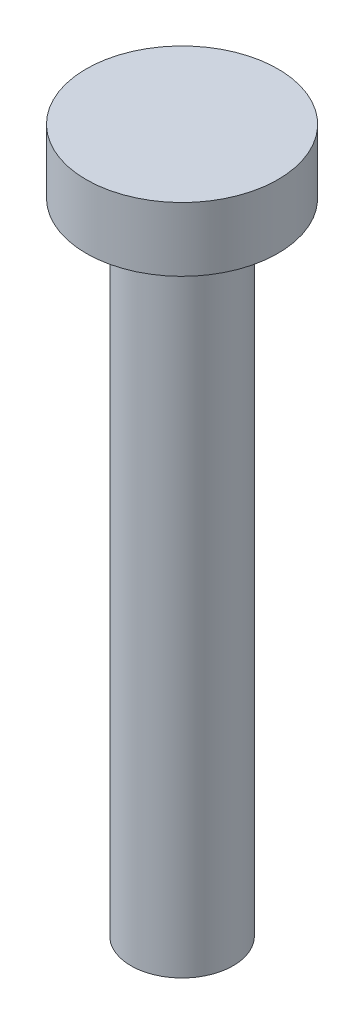
ISO-10303-21;
HEADER;
FILE_DESCRIPTION(('STEP AP214'),'2;1');
FILE_NAME('part.step','',(''),(''),'','','');
FILE_SCHEMA(('AUTOMOTIVE_DESIGN { 1 0 10303 214 1 1 1 1 }'));
ENDSEC;
DATA;
#1=APPLICATION_CONTEXT('core data for automotive mechanical design processes');
#2=APPLICATION_PROTOCOL_DEFINITION('international standard','automotive_design',2000,#1);
#3=PRODUCT_CONTEXT('',#1,'mechanical');
#4=PRODUCT('Part','Part','',(#3));
#5=PRODUCT_RELATED_PRODUCT_CATEGORY('part','',(#4));
#6=PRODUCT_DEFINITION_FORMATION('','',#4);
#7=PRODUCT_DEFINITION_CONTEXT('part definition',#1,'design');
#8=PRODUCT_DEFINITION('design','',#6,#7);
#9=PRODUCT_DEFINITION_SHAPE('','',#8);
#10=(LENGTH_UNIT() NAMED_UNIT(*) SI_UNIT(.MILLI.,.METRE.));
#11=(NAMED_UNIT(*) PLANE_ANGLE_UNIT() SI_UNIT($,.RADIAN.));
#12=(NAMED_UNIT(*) SI_UNIT($,.STERADIAN.) SOLID_ANGLE_UNIT());
#13=UNCERTAINTY_MEASURE_WITH_UNIT(LENGTH_MEASURE(1.E-05),#10,'distance_accuracy_value','');
#14=(GEOMETRIC_REPRESENTATION_CONTEXT(3) GLOBAL_UNCERTAINTY_ASSIGNED_CONTEXT((#13)) GLOBAL_UNIT_ASSIGNED_CONTEXT((#10,
#11,#12)) REPRESENTATION_CONTEXT('',''));
#15=CARTESIAN_POINT('',(0.,0.,0.));
#16=DIRECTION('',(0.,0.,1.));
#17=DIRECTION('',(1.,0.,0.));
#18=AXIS2_PLACEMENT_3D('',#15,#16,#17);
#19=CARTESIAN_POINT('',(0.,100.,0.));
#20=DIRECTION('',(0.,-1.,0.));
#21=DIRECTION('',(0.,0.,-1.));
#22=AXIS2_PLACEMENT_3D('',#19,#20,#21);
#23=CYLINDRICAL_SURFACE('',#22,8.);
#24=CARTESIAN_POINT('',(0.,100.,0.));
#25=DIRECTION('',(0.,1.,0.));
#26=DIRECTION('',(0.,0.,1.));
#27=AXIS2_PLACEMENT_3D('',#24,#25,#26);
#28=CIRCLE('',#27,8.);
#29=CARTESIAN_POINT('',(0.,100.,8.));
#30=VERTEX_POINT('',#29);
#31=EDGE_CURVE('E10',#30,#30,#28,.T.);
#32=ORIENTED_EDGE('',*,*,#31,.F.);
#33=EDGE_LOOP('',(#32));
#34=FACE_BOUND('',#33,.T.);
#35=CARTESIAN_POINT('',(0.,0.,0.));
#36=DIRECTION('',(0.,1.,0.));
#37=DIRECTION('',(0.,0.,1.));
#38=AXIS2_PLACEMENT_3D('',#35,#36,#37);
#39=CIRCLE('',#38,8.);
#40=CARTESIAN_POINT('',(0.,0.,8.));
#41=VERTEX_POINT('',#40);
#42=EDGE_CURVE('E37',#41,#41,#39,.T.);
#43=ORIENTED_EDGE('',*,*,#42,.T.);
#44=EDGE_LOOP('',(#43));
#45=FACE_BOUND('',#44,.T.);
#46=ADVANCED_FACE('F34',(#34,#45),#23,.T.);
#47=CARTESIAN_POINT('',(0.,0.,0.));
#48=DIRECTION('',(0.,1.,0.));
#49=DIRECTION('',(0.,0.,1.));
#50=AXIS2_PLACEMENT_3D('',#47,#48,#49);
#51=PLANE('',#50);
#52=ORIENTED_EDGE('',*,*,#42,.F.);
#53=EDGE_LOOP('',(#52));
#54=FACE_BOUND('',#53,.T.);
#55=ADVANCED_FACE('F57',(#54),#51,.F.);
#56=CARTESIAN_POINT('',(0.,110.,0.));
#57=DIRECTION('',(0.,-1.,0.));
#58=DIRECTION('',(0.,0.,-1.));
#59=AXIS2_PLACEMENT_3D('',#56,#57,#58);
#60=CYLINDRICAL_SURFACE('',#59,15.);
#61=CARTESIAN_POINT('',(0.,110.,0.));
#62=DIRECTION('',(0.,1.,0.));
#63=DIRECTION('',(0.,0.,1.));
#64=AXIS2_PLACEMENT_3D('',#61,#62,#63);
#65=CIRCLE('',#64,15.);
#66=CARTESIAN_POINT('',(0.,110.,15.));
#67=VERTEX_POINT('',#66);
#68=EDGE_CURVE('E44',#67,#67,#65,.T.);
#69=ORIENTED_EDGE('',*,*,#68,.F.);
#70=EDGE_LOOP('',(#69));
#71=FACE_BOUND('',#70,.T.);
#72=CARTESIAN_POINT('',(0.,100.,0.));
#73=DIRECTION('',(0.,1.,0.));
#74=DIRECTION('',(0.,0.,1.));
#75=AXIS2_PLACEMENT_3D('',#72,#73,#74);
#76=CIRCLE('',#75,15.);
#77=CARTESIAN_POINT('',(0.,100.,15.));
#78=VERTEX_POINT('',#77);
#79=EDGE_CURVE('E46',#78,#78,#76,.T.);
#80=ORIENTED_EDGE('',*,*,#79,.T.);
#81=EDGE_LOOP('',(#80));
#82=FACE_BOUND('',#81,.T.);
#83=ADVANCED_FACE('F54',(#71,#82),#60,.T.);
#84=CARTESIAN_POINT('',(0.,110.,0.));
#85=DIRECTION('',(0.,1.,0.));
#86=DIRECTION('',(0.,0.,1.));
#87=AXIS2_PLACEMENT_3D('',#84,#85,#86);
#88=PLANE('',#87);
#89=ORIENTED_EDGE('',*,*,#68,.T.);
#90=EDGE_LOOP('',(#89));
#91=FACE_BOUND('',#90,.T.);
#92=ADVANCED_FACE('F52',(#91),#88,.T.);
#93=CARTESIAN_POINT('',(0.,100.,0.));
#94=DIRECTION('',(0.,1.,0.));
#95=DIRECTION('',(0.,0.,1.));
#96=AXIS2_PLACEMENT_3D('',#93,#94,#95);
#97=PLANE('',#96);
#98=ORIENTED_EDGE('',*,*,#31,.T.);
#99=EDGE_LOOP('',(#98));
#100=FACE_BOUND('',#99,.T.);
#101=ORIENTED_EDGE('',*,*,#79,.F.);
#102=EDGE_LOOP('',(#101));
#103=FACE_BOUND('',#102,.T.);
#104=ADVANCED_FACE('F61',(#100,#103),#97,.F.);
#105=CLOSED_SHELL('',(#46,#55,#83,#92,#104));
#106=MANIFOLD_SOLID_BREP('B2',#105);
#107=ADVANCED_BREP_SHAPE_REPRESENTATION('',(#18,#106),#14);
#108=SHAPE_DEFINITION_REPRESENTATION(#9,#107);
ENDSEC;
END-ISO-10303-21;
